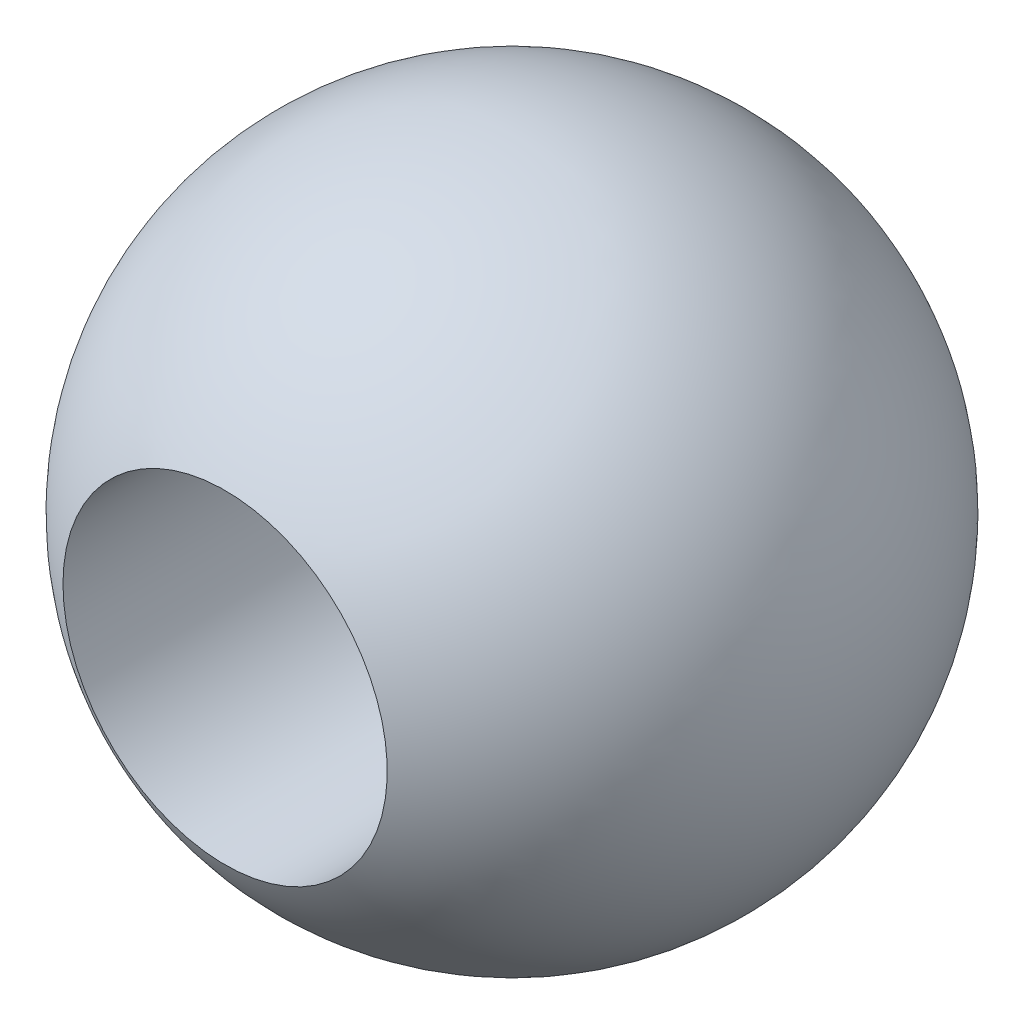
ISO-10303-21;
HEADER;
FILE_DESCRIPTION(('STEP AP214'),'2;1');
FILE_NAME('part.step','',(''),(''),'','','');
FILE_SCHEMA(('AUTOMOTIVE_DESIGN { 1 0 10303 214 1 1 1 1 }'));
ENDSEC;
DATA;
#1=APPLICATION_CONTEXT('core data for automotive mechanical design processes');
#2=APPLICATION_PROTOCOL_DEFINITION('international standard','automotive_design',2000,#1);
#3=PRODUCT_CONTEXT('',#1,'mechanical');
#4=PRODUCT('Part','Part','',(#3));
#5=PRODUCT_RELATED_PRODUCT_CATEGORY('part','',(#4));
#6=PRODUCT_DEFINITION_FORMATION('','',#4);
#7=PRODUCT_DEFINITION_CONTEXT('part definition',#1,'design');
#8=PRODUCT_DEFINITION('design','',#6,#7);
#9=PRODUCT_DEFINITION_SHAPE('','',#8);
#10=(LENGTH_UNIT() NAMED_UNIT(*) SI_UNIT(.MILLI.,.METRE.));
#11=(NAMED_UNIT(*) PLANE_ANGLE_UNIT() SI_UNIT($,.RADIAN.));
#12=(NAMED_UNIT(*) SI_UNIT($,.STERADIAN.) SOLID_ANGLE_UNIT());
#13=UNCERTAINTY_MEASURE_WITH_UNIT(LENGTH_MEASURE(1.E-05),#10,'distance_accuracy_value','');
#14=(GEOMETRIC_REPRESENTATION_CONTEXT(3) GLOBAL_UNCERTAINTY_ASSIGNED_CONTEXT((#13)) GLOBAL_UNIT_ASSIGNED_CONTEXT((#10,
#11,#12)) REPRESENTATION_CONTEXT('',''));
#15=CARTESIAN_POINT('',(0.,0.,0.));
#16=DIRECTION('',(0.,0.,1.));
#17=DIRECTION('',(1.,0.,0.));
#18=AXIS2_PLACEMENT_3D('',#15,#16,#17);
#19=CARTESIAN_POINT('',(0.,0.,0.));
#20=DIRECTION('',(0.,1.,0.));
#21=DIRECTION('',(1.,0.,0.));
#22=AXIS2_PLACEMENT_3D('',#19,#20,#21);
#23=SPHERICAL_SURFACE('',#22,3.15);
#24=CARTESIAN_POINT('',(0.,0.,0.));
#25=DIRECTION('',(0.,0.,-1.));
#26=DIRECTION('',(-1.,0.,0.));
#27=AXIS2_PLACEMENT_3D('',#24,#25,#26);
#28=SPHERICAL_SURFACE('',#27,3.15);
#29=CARTESIAN_POINT('',(0.,0.,2.74226184016042));
#30=DIRECTION('',(0.,0.,-1.));
#31=DIRECTION('',(-1.,0.,0.));
#32=AXIS2_PLACEMENT_3D('',#29,#30,#31);
#33=CIRCLE('',#32,1.55);
#34=CARTESIAN_POINT('',(-1.55,0.,2.74226184016042));
#35=VERTEX_POINT('',#34);
#36=EDGE_CURVE('E50',#35,#35,#33,.F.);
#37=ORIENTED_EDGE('',*,*,#36,.F.);
#38=EDGE_LOOP('',(#37));
#39=FACE_BOUND('',#38,.T.);
#40=CARTESIAN_POINT('',(0.,0.,-2.74226184016042));
#41=DIRECTION('',(0.,0.,1.));
#42=DIRECTION('',(1.,0.,0.));
#43=AXIS2_PLACEMENT_3D('',#40,#41,#42);
#44=CIRCLE('',#43,1.55);
#45=CARTESIAN_POINT('',(1.55,0.,-2.74226184016042));
#46=VERTEX_POINT('',#45);
#47=EDGE_CURVE('E10',#46,#46,#44,.F.);
#48=ORIENTED_EDGE('',*,*,#47,.F.);
#49=EDGE_LOOP('',(#48));
#50=FACE_BOUND('',#49,.T.);
#51=ADVANCED_FACE('F43',(#39,#50),#28,.T.);
#52=CARTESIAN_POINT('',(0.,0.,10.));
#53=DIRECTION('',(0.,0.,-1.));
#54=DIRECTION('',(-1.,0.,0.));
#55=AXIS2_PLACEMENT_3D('',#52,#53,#54);
#56=CYLINDRICAL_SURFACE('',#55,1.55);
#57=ORIENTED_EDGE('',*,*,#36,.T.);
#58=EDGE_LOOP('',(#57));
#59=FACE_BOUND('',#58,.T.);
#60=ORIENTED_EDGE('',*,*,#47,.T.);
#61=EDGE_LOOP('',(#60));
#62=FACE_BOUND('',#61,.T.);
#63=ADVANCED_FACE('F57',(#59,#62),#56,.F.);
#64=CLOSED_SHELL('',(#51,#63));
#65=MANIFOLD_SOLID_BREP('B2',#64);
#66=ADVANCED_BREP_SHAPE_REPRESENTATION('',(#18,#65),#14);
#67=SHAPE_DEFINITION_REPRESENTATION(#9,#66);
ENDSEC;
END-ISO-10303-21;
